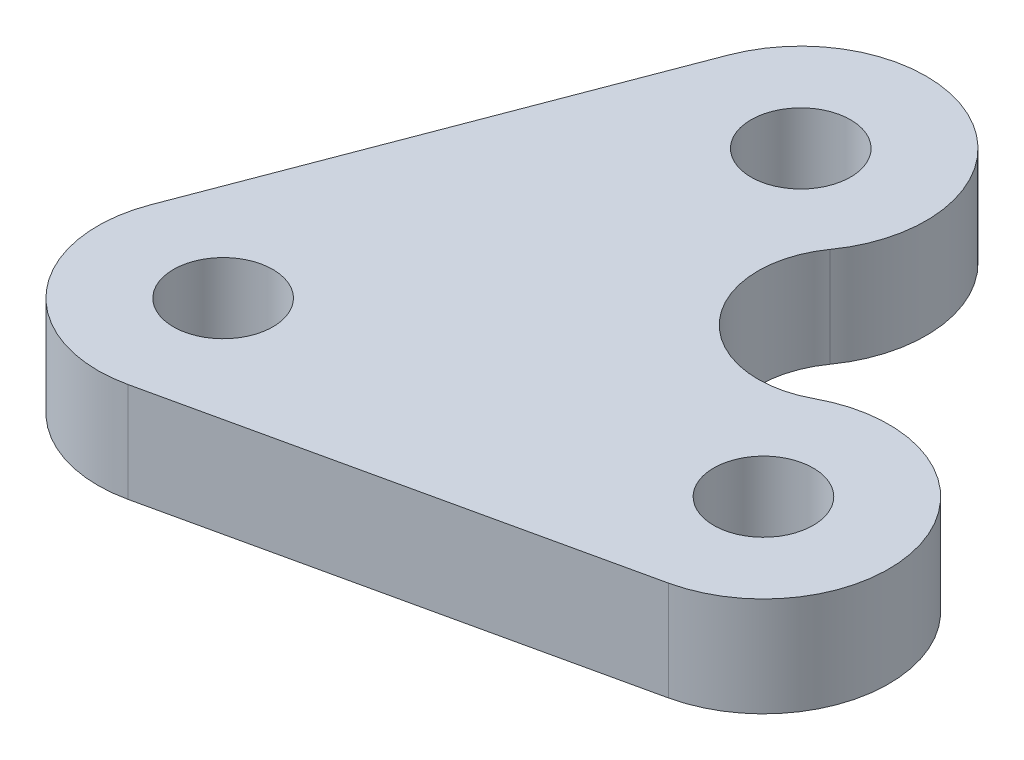
ISO-10303-21;
HEADER;
FILE_DESCRIPTION(('STEP AP214'),'2;1');
FILE_NAME('part.step','',(''),(''),'','','');
FILE_SCHEMA(('AUTOMOTIVE_DESIGN { 1 0 10303 214 1 1 1 1 }'));
ENDSEC;
DATA;
#1=APPLICATION_CONTEXT('core data for automotive mechanical design processes');
#2=APPLICATION_PROTOCOL_DEFINITION('international standard','automotive_design',2000,#1);
#3=PRODUCT_CONTEXT('',#1,'mechanical');
#4=PRODUCT('Part','Part','',(#3));
#5=PRODUCT_RELATED_PRODUCT_CATEGORY('part','',(#4));
#6=PRODUCT_DEFINITION_FORMATION('','',#4);
#7=PRODUCT_DEFINITION_CONTEXT('part definition',#1,'design');
#8=PRODUCT_DEFINITION('design','',#6,#7);
#9=PRODUCT_DEFINITION_SHAPE('','',#8);
#10=(LENGTH_UNIT() NAMED_UNIT(*) SI_UNIT(.MILLI.,.METRE.));
#11=(NAMED_UNIT(*) PLANE_ANGLE_UNIT() SI_UNIT($,.RADIAN.));
#12=(NAMED_UNIT(*) SI_UNIT($,.STERADIAN.) SOLID_ANGLE_UNIT());
#13=UNCERTAINTY_MEASURE_WITH_UNIT(LENGTH_MEASURE(1.E-05),#10,'distance_accuracy_value','');
#14=(GEOMETRIC_REPRESENTATION_CONTEXT(3) GLOBAL_UNCERTAINTY_ASSIGNED_CONTEXT((#13)) GLOBAL_UNIT_ASSIGNED_CONTEXT((#10,
#11,#12)) REPRESENTATION_CONTEXT('',''));
#15=CARTESIAN_POINT('',(0.,0.,0.));
#16=DIRECTION('',(0.,0.,1.));
#17=DIRECTION('',(1.,0.,0.));
#18=AXIS2_PLACEMENT_3D('',#15,#16,#17);
#19=CARTESIAN_POINT('',(19.8336046260215,0.,38.1));
#20=DIRECTION('',(0.,-1.,0.));
#21=DIRECTION('',(1.,0.,0.));
#22=AXIS2_PLACEMENT_3D('',#19,#20,#21);
#23=CYLINDRICAL_SURFACE('',#22,3.175);
#24=CARTESIAN_POINT('',(19.8336046260215,0.,38.1));
#25=DIRECTION('',(0.,-1.,0.));
#26=DIRECTION('',(1.,0.,0.));
#27=AXIS2_PLACEMENT_3D('',#24,#25,#26);
#28=CIRCLE('',#27,3.175);
#29=CARTESIAN_POINT('',(16.6586046260215,0.,38.1));
#30=VERTEX_POINT('',#29);
#31=EDGE_CURVE('E39',#30,#30,#28,.T.);
#32=ORIENTED_EDGE('',*,*,#31,.F.);
#33=DIRECTION('',(0.,-1.,0.));
#34=VECTOR('',#33,1.);
#35=CARTESIAN_POINT('',(16.6586046260215,0.,38.1));
#36=LINE('',#35,#34);
#37=CARTESIAN_POINT('',(16.6586046260215,-6.35,38.1));
#38=VERTEX_POINT('',#37);
#39=EDGE_CURVE('E11',#30,#38,#36,.T.);
#40=ORIENTED_EDGE('',*,*,#39,.T.);
#41=CARTESIAN_POINT('',(19.8336046260215,-6.35,38.1));
#42=DIRECTION('',(0.,1.,0.));
#43=DIRECTION('',(1.,0.,0.));
#44=AXIS2_PLACEMENT_3D('',#41,#42,#43);
#45=CIRCLE('',#44,3.175);
#46=EDGE_CURVE('E186',#38,#38,#45,.T.);
#47=ORIENTED_EDGE('',*,*,#46,.F.);
#48=ORIENTED_EDGE('',*,*,#39,.F.);
#49=EDGE_LOOP('',(#32,#40,#47,#48));
#50=FACE_BOUND('',#49,.T.);
#51=ADVANCED_FACE('F16',(#50),#23,.F.);
#52=CARTESIAN_POINT('',(-8.38170556805383,0.,44.3683830899938));
#53=DIRECTION('',(0.,-1.,0.));
#54=DIRECTION('',(1.,0.,0.));
#55=AXIS2_PLACEMENT_3D('',#52,#53,#54);
#56=CYLINDRICAL_SURFACE('',#55,3.175);
#57=CARTESIAN_POINT('',(-8.38170556805383,0.,44.3683830899938));
#58=DIRECTION('',(0.,-1.,0.));
#59=DIRECTION('',(1.,0.,0.));
#60=AXIS2_PLACEMENT_3D('',#57,#58,#59);
#61=CIRCLE('',#60,3.175);
#62=CARTESIAN_POINT('',(-11.5567055680538,0.,44.3683830899938));
#63=VERTEX_POINT('',#62);
#64=EDGE_CURVE('E153',#63,#63,#61,.T.);
#65=ORIENTED_EDGE('',*,*,#64,.F.);
#66=DIRECTION('',(0.,-1.,0.));
#67=VECTOR('',#66,1.);
#68=CARTESIAN_POINT('',(-11.5567055680538,0.,44.3683830899938));
#69=LINE('',#68,#67);
#70=CARTESIAN_POINT('',(-11.5567055680538,-6.35,44.3683830899938));
#71=VERTEX_POINT('',#70);
#72=EDGE_CURVE('E27',#63,#71,#69,.T.);
#73=ORIENTED_EDGE('',*,*,#72,.T.);
#74=CARTESIAN_POINT('',(-8.38170556805383,-6.35,44.3683830899938));
#75=DIRECTION('',(0.,1.,0.));
#76=DIRECTION('',(1.,0.,0.));
#77=AXIS2_PLACEMENT_3D('',#74,#75,#76);
#78=CIRCLE('',#77,3.175);
#79=EDGE_CURVE('E158',#71,#71,#78,.T.);
#80=ORIENTED_EDGE('',*,*,#79,.F.);
#81=ORIENTED_EDGE('',*,*,#72,.F.);
#82=EDGE_LOOP('',(#65,#73,#80,#81));
#83=FACE_BOUND('',#82,.T.);
#84=ADVANCED_FACE('F244',(#83),#56,.F.);
#85=CARTESIAN_POINT('',(1.77593854121521,0.,17.6597161230815));
#86=DIRECTION('',(0.,-1.,0.));
#87=DIRECTION('',(1.,0.,0.));
#88=AXIS2_PLACEMENT_3D('',#85,#86,#87);
#89=CYLINDRICAL_SURFACE('',#88,3.175);
#90=CARTESIAN_POINT('',(1.77593854121521,0.,17.6597161230815));
#91=DIRECTION('',(0.,-1.,0.));
#92=DIRECTION('',(1.,0.,0.));
#93=AXIS2_PLACEMENT_3D('',#90,#91,#92);
#94=CIRCLE('',#93,3.175);
#95=CARTESIAN_POINT('',(-1.3990614587848,0.,17.6597161230815));
#96=VERTEX_POINT('',#95);
#97=EDGE_CURVE('E149',#96,#96,#94,.T.);
#98=ORIENTED_EDGE('',*,*,#97,.F.);
#99=DIRECTION('',(0.,-1.,0.));
#100=VECTOR('',#99,1.);
#101=CARTESIAN_POINT('',(-1.39906145878479,0.,17.6597161230815));
#102=LINE('',#101,#100);
#103=CARTESIAN_POINT('',(-1.3990614587848,-6.35,17.6597161230815));
#104=VERTEX_POINT('',#103);
#105=EDGE_CURVE('E145',#96,#104,#102,.T.);
#106=ORIENTED_EDGE('',*,*,#105,.T.);
#107=CARTESIAN_POINT('',(1.77593854121521,-6.35,17.6597161230815));
#108=DIRECTION('',(0.,1.,0.));
#109=DIRECTION('',(1.,0.,0.));
#110=AXIS2_PLACEMENT_3D('',#107,#108,#109);
#111=CIRCLE('',#110,3.175);
#112=EDGE_CURVE('E154',#104,#104,#111,.T.);
#113=ORIENTED_EDGE('',*,*,#112,.F.);
#114=ORIENTED_EDGE('',*,*,#105,.F.);
#115=EDGE_LOOP('',(#98,#106,#113,#114));
#116=FACE_BOUND('',#115,.T.);
#117=ADVANCED_FACE('F249',(#116),#89,.F.);
#118=CARTESIAN_POINT('',(-8.38170556805383,0.,44.3683830899938));
#119=DIRECTION('',(0.,-1.,0.));
#120=DIRECTION('',(-0.934686508028427,0.,-0.355473109685705));
#121=AXIS2_PLACEMENT_3D('',#118,#119,#120);
#122=CYLINDRICAL_SURFACE('',#121,8.0000000000001);
#123=CARTESIAN_POINT('',(-8.38170556805383,0.,44.3683830899938));
#124=DIRECTION('',(0.,1.,0.));
#125=DIRECTION('',(-0.934686508028427,0.,-0.355473109685705));
#126=AXIS2_PLACEMENT_3D('',#123,#124,#125);
#127=CIRCLE('',#126,8.0000000000001);
#128=CARTESIAN_POINT('',(-15.8591976322813,0.,41.5245982125082));
#129=VERTEX_POINT('',#128);
#130=CARTESIAN_POINT('',(-6.64670656688789,0.,52.1779783718221));
#131=VERTEX_POINT('',#130);
#132=EDGE_CURVE('E105',#129,#131,#127,.T.);
#133=ORIENTED_EDGE('',*,*,#132,.F.);
#134=DIRECTION('',(0.,-1.,0.));
#135=VECTOR('',#134,1.);
#136=CARTESIAN_POINT('',(-15.8591976322813,0.,41.5245982125082));
#137=LINE('',#136,#135);
#138=CARTESIAN_POINT('',(-15.8591976322813,-6.35,41.5245982125082));
#139=VERTEX_POINT('',#138);
#140=EDGE_CURVE('E125',#129,#139,#137,.T.);
#141=ORIENTED_EDGE('',*,*,#140,.T.);
#142=CARTESIAN_POINT('',(-8.38170556805383,-6.35,44.3683830899938));
#143=DIRECTION('',(0.,-1.,0.));
#144=DIRECTION('',(-0.934686508028427,0.,-0.355473109685705));
#145=AXIS2_PLACEMENT_3D('',#142,#143,#144);
#146=CIRCLE('',#145,8.0000000000001);
#147=CARTESIAN_POINT('',(-6.64670656688789,-6.35,52.1779783718221));
#148=VERTEX_POINT('',#147);
#149=EDGE_CURVE('E20',#148,#139,#146,.T.);
#150=ORIENTED_EDGE('',*,*,#149,.F.);
#151=DIRECTION('',(0.,-1.,0.));
#152=VECTOR('',#151,1.);
#153=CARTESIAN_POINT('',(-6.64670656688789,0.,52.1779783718221));
#154=LINE('',#153,#152);
#155=EDGE_CURVE('E120',#131,#148,#154,.T.);
#156=ORIENTED_EDGE('',*,*,#155,.F.);
#157=EDGE_LOOP('',(#133,#141,#150,#156));
#158=FACE_BOUND('',#157,.T.);
#159=ADVANCED_FACE('F121',(#158),#122,.T.);
#160=CARTESIAN_POINT('',(21.5686036271875,0.,45.9095952818283));
#161=DIRECTION('',(0.21687487514574,0.,0.976199410228525));
#162=DIRECTION('',(0.,-1.,0.));
#163=AXIS2_PLACEMENT_3D('',#160,#161,#162);
#164=PLANE('',#163);
#165=DIRECTION('',(0.976199410228525,0.,-0.21687487514574));
#166=VECTOR('',#165,1.);
#167=CARTESIAN_POINT('',(-6.64670656688789,0.,52.1779783718221));
#168=LINE('',#167,#166);
#169=CARTESIAN_POINT('',(21.5686036271875,0.,45.9095952818283));
#170=VERTEX_POINT('',#169);
#171=EDGE_CURVE('E110',#131,#170,#168,.T.);
#172=ORIENTED_EDGE('',*,*,#171,.F.);
#173=ORIENTED_EDGE('',*,*,#155,.T.);
#174=DIRECTION('',(-0.976199410228525,0.,0.21687487514574));
#175=VECTOR('',#174,1.);
#176=CARTESIAN_POINT('',(-6.64670656688789,-6.35,52.1779783718221));
#177=LINE('',#176,#175);
#178=CARTESIAN_POINT('',(21.5686036271875,-6.35,45.9095952818283));
#179=VERTEX_POINT('',#178);
#180=EDGE_CURVE('E218',#179,#148,#177,.T.);
#181=ORIENTED_EDGE('',*,*,#180,.F.);
#182=DIRECTION('',(0.,-1.,0.));
#183=VECTOR('',#182,1.);
#184=CARTESIAN_POINT('',(21.5686036271875,0.,45.9095952818283));
#185=LINE('',#184,#183);
#186=EDGE_CURVE('E126',#170,#179,#185,.T.);
#187=ORIENTED_EDGE('',*,*,#186,.F.);
#188=EDGE_LOOP('',(#172,#173,#181,#187));
#189=FACE_BOUND('',#188,.T.);
#190=ADVANCED_FACE('F18',(#189),#164,.T.);
#191=CARTESIAN_POINT('',(19.8336046260215,0.,38.1));
#192=DIRECTION('',(0.,-1.,0.));
#193=DIRECTION('',(0.936945615897928,0.,-0.349475196329657));
#194=AXIS2_PLACEMENT_3D('',#191,#192,#193);
#195=CYLINDRICAL_SURFACE('',#194,8.00000000000011);
#196=CARTESIAN_POINT('',(19.8336046260215,0.,38.1));
#197=DIRECTION('',(0.,1.,0.));
#198=DIRECTION('',(0.216874875145739,0.,0.976199410228525));
#199=AXIS2_PLACEMENT_3D('',#196,#197,#198);
#200=CIRCLE('',#199,8.00000000000011);
#201=CARTESIAN_POINT('',(16.0304665719188,0.,31.0618084040403));
#202=VERTEX_POINT('',#201);
#203=EDGE_CURVE('E131',#170,#202,#200,.T.);
#204=ORIENTED_EDGE('',*,*,#203,.F.);
#205=ORIENTED_EDGE('',*,*,#186,.T.);
#206=CARTESIAN_POINT('',(19.8336046260215,-6.35,38.1));
#207=DIRECTION('',(0.,-1.,0.));
#208=DIRECTION('',(0.216874875145739,0.,0.976199410228525));
#209=AXIS2_PLACEMENT_3D('',#206,#207,#208);
#210=CIRCLE('',#209,8.00000000000011);
#211=CARTESIAN_POINT('',(16.0304665719188,-6.35,31.0618084040403));
#212=VERTEX_POINT('',#211);
#213=EDGE_CURVE('E181',#212,#179,#210,.T.);
#214=ORIENTED_EDGE('',*,*,#213,.F.);
#215=DIRECTION('',(0.,-1.,0.));
#216=VECTOR('',#215,1.);
#217=CARTESIAN_POINT('',(16.0304665719188,0.,31.0618084040403));
#218=LINE('',#217,#216);
#219=EDGE_CURVE('E171',#202,#212,#218,.T.);
#220=ORIENTED_EDGE('',*,*,#219,.F.);
#221=EDGE_LOOP('',(#204,#205,#214,#220));
#222=FACE_BOUND('',#221,.T.);
#223=ADVANCED_FACE('F233',(#222),#195,.T.);
#224=CARTESIAN_POINT('',(13.1781130313417,0.,25.7831647070706));
#225=DIRECTION('',(0.,-1.,0.));
#226=DIRECTION('',(-0.814441035009026,0.,-0.58024632742778));
#227=AXIS2_PLACEMENT_3D('',#224,#225,#226);
#228=CYLINDRICAL_SURFACE('',#227,6.00000000000008);
#229=CARTESIAN_POINT('',(13.1781130313417,0.,25.7831647070706));
#230=DIRECTION('',(0.,1.,0.));
#231=DIRECTION('',(-0.814441035009026,0.,-0.58024632742778));
#232=AXIS2_PLACEMENT_3D('',#229,#230,#231);
#233=CIRCLE('',#232,6.00000000000008);
#234=CARTESIAN_POINT('',(8.29146682128749,0.,22.3016867425038));
#235=VERTEX_POINT('',#234);
#236=EDGE_CURVE('E168',#235,#202,#233,.T.);
#237=ORIENTED_EDGE('',*,*,#236,.T.);
#238=ORIENTED_EDGE('',*,*,#219,.T.);
#239=CARTESIAN_POINT('',(13.1781130313417,-6.35,25.7831647070706));
#240=DIRECTION('',(0.,1.,0.));
#241=DIRECTION('',(-0.814441035009026,0.,-0.58024632742778));
#242=AXIS2_PLACEMENT_3D('',#239,#240,#241);
#243=CIRCLE('',#242,6.00000000000008);
#244=CARTESIAN_POINT('',(8.29146682128749,-6.35,22.3016867425038));
#245=VERTEX_POINT('',#244);
#246=EDGE_CURVE('E176',#245,#212,#243,.T.);
#247=ORIENTED_EDGE('',*,*,#246,.F.);
#248=DIRECTION('',(0.,-1.,0.));
#249=VECTOR('',#248,1.);
#250=CARTESIAN_POINT('',(8.29146682128749,0.,22.3016867425038));
#251=LINE('',#250,#249);
#252=EDGE_CURVE('E162',#235,#245,#251,.T.);
#253=ORIENTED_EDGE('',*,*,#252,.F.);
#254=EDGE_LOOP('',(#237,#238,#247,#253));
#255=FACE_BOUND('',#254,.T.);
#256=ADVANCED_FACE('F231',(#255),#228,.F.);
#257=CARTESIAN_POINT('',(1.77593854121521,0.,17.6597161230815));
#258=DIRECTION('',(0.,-1.,0.));
#259=DIRECTION('',(0.471706963795754,0.,-0.881755374413216));
#260=AXIS2_PLACEMENT_3D('',#257,#258,#259);
#261=CYLINDRICAL_SURFACE('',#260,8.0000000000001);
#262=CARTESIAN_POINT('',(1.77593854121521,0.,17.6597161230815));
#263=DIRECTION('',(0.,1.,0.));
#264=DIRECTION('',(0.814441035009025,0.,0.580246327427781));
#265=AXIS2_PLACEMENT_3D('',#262,#263,#264);
#266=CIRCLE('',#265,8.0000000000001);
#267=CARTESIAN_POINT('',(-5.70155352301231,0.,14.8159312455959));
#268=VERTEX_POINT('',#267);
#269=EDGE_CURVE('E137',#235,#268,#266,.T.);
#270=ORIENTED_EDGE('',*,*,#269,.F.);
#271=ORIENTED_EDGE('',*,*,#252,.T.);
#272=CARTESIAN_POINT('',(1.77593854121521,-6.35,17.6597161230815));
#273=DIRECTION('',(0.,-1.,0.));
#274=DIRECTION('',(0.814441035009025,0.,0.580246327427781));
#275=AXIS2_PLACEMENT_3D('',#272,#273,#274);
#276=CIRCLE('',#275,8.0000000000001);
#277=CARTESIAN_POINT('',(-5.70155352301231,-6.35,14.8159312455959));
#278=VERTEX_POINT('',#277);
#279=EDGE_CURVE('E180',#278,#245,#276,.T.);
#280=ORIENTED_EDGE('',*,*,#279,.F.);
#281=DIRECTION('',(0.,-1.,0.));
#282=VECTOR('',#281,1.);
#283=CARTESIAN_POINT('',(-5.70155352301231,0.,14.8159312455959));
#284=LINE('',#283,#282);
#285=EDGE_CURVE('E148',#268,#278,#284,.T.);
#286=ORIENTED_EDGE('',*,*,#285,.F.);
#287=EDGE_LOOP('',(#270,#271,#280,#286));
#288=FACE_BOUND('',#287,.T.);
#289=ADVANCED_FACE('F229',(#288),#261,.T.);
#290=CARTESIAN_POINT('',(-15.8591976322813,0.,41.5245982125082));
#291=DIRECTION('',(-0.934686508028427,0.,-0.355473109685706));
#292=DIRECTION('',(-0.355473109685706,0.,0.934686508028427));
#293=AXIS2_PLACEMENT_3D('',#290,#291,#292);
#294=PLANE('',#293);
#295=DIRECTION('',(-0.355473109685706,0.,0.934686508028427));
#296=VECTOR('',#295,1.);
#297=CARTESIAN_POINT('',(-5.70155352301231,0.,14.8159312455959));
#298=LINE('',#297,#296);
#299=EDGE_CURVE('E113',#268,#129,#298,.T.);
#300=ORIENTED_EDGE('',*,*,#299,.F.);
#301=ORIENTED_EDGE('',*,*,#285,.T.);
#302=DIRECTION('',(0.355473109685706,0.,-0.934686508028427));
#303=VECTOR('',#302,1.);
#304=CARTESIAN_POINT('',(-5.70155352301231,-6.35,14.8159312455959));
#305=LINE('',#304,#303);
#306=EDGE_CURVE('E141',#139,#278,#305,.T.);
#307=ORIENTED_EDGE('',*,*,#306,.F.);
#308=ORIENTED_EDGE('',*,*,#140,.F.);
#309=EDGE_LOOP('',(#300,#301,#307,#308));
#310=FACE_BOUND('',#309,.T.);
#311=ADVANCED_FACE('F227',(#310),#294,.T.);
#312=CARTESIAN_POINT('',(5.72594952898385,0.,31.0140496065377));
#313=DIRECTION('',(0.,1.,0.));
#314=DIRECTION('',(1.,0.,0.));
#315=AXIS2_PLACEMENT_3D('',#312,#313,#314);
#316=PLANE('',#315);
#317=ORIENTED_EDGE('',*,*,#299,.T.);
#318=ORIENTED_EDGE('',*,*,#132,.T.);
#319=ORIENTED_EDGE('',*,*,#171,.T.);
#320=ORIENTED_EDGE('',*,*,#203,.T.);
#321=ORIENTED_EDGE('',*,*,#236,.F.);
#322=ORIENTED_EDGE('',*,*,#269,.T.);
#323=EDGE_LOOP('',(#317,#318,#319,#320,#321,#322));
#324=FACE_BOUND('',#323,.T.);
#325=ORIENTED_EDGE('',*,*,#97,.T.);
#326=EDGE_LOOP('',(#325));
#327=FACE_BOUND('',#326,.T.);
#328=ORIENTED_EDGE('',*,*,#64,.T.);
#329=EDGE_LOOP('',(#328));
#330=FACE_BOUND('',#329,.T.);
#331=ORIENTED_EDGE('',*,*,#31,.T.);
#332=EDGE_LOOP('',(#331));
#333=FACE_BOUND('',#332,.T.);
#334=ADVANCED_FACE('F107',(#324,#327,#330,#333),#316,.T.);
#335=CARTESIAN_POINT('',(5.72594952898385,-6.35,31.0140496065377));
#336=DIRECTION('',(0.,1.,0.));
#337=DIRECTION('',(1.,0.,0.));
#338=AXIS2_PLACEMENT_3D('',#335,#336,#337);
#339=PLANE('',#338);
#340=ORIENTED_EDGE('',*,*,#306,.T.);
#341=ORIENTED_EDGE('',*,*,#279,.T.);
#342=ORIENTED_EDGE('',*,*,#246,.T.);
#343=ORIENTED_EDGE('',*,*,#213,.T.);
#344=ORIENTED_EDGE('',*,*,#180,.T.);
#345=ORIENTED_EDGE('',*,*,#149,.T.);
#346=EDGE_LOOP('',(#340,#341,#342,#343,#344,#345));
#347=FACE_BOUND('',#346,.T.);
#348=ORIENTED_EDGE('',*,*,#112,.T.);
#349=EDGE_LOOP('',(#348));
#350=FACE_BOUND('',#349,.T.);
#351=ORIENTED_EDGE('',*,*,#79,.T.);
#352=EDGE_LOOP('',(#351));
#353=FACE_BOUND('',#352,.T.);
#354=ORIENTED_EDGE('',*,*,#46,.T.);
#355=EDGE_LOOP('',(#354));
#356=FACE_BOUND('',#355,.T.);
#357=ADVANCED_FACE('F224',(#347,#350,#353,#356),#339,.F.);
#358=CLOSED_SHELL('',(#51,#84,#117,#159,#190,#223,#256,#289,#311,#334,#357));
#359=MANIFOLD_SOLID_BREP('B1',#358);
#360=ADVANCED_BREP_SHAPE_REPRESENTATION('',(#18,#359),#14);
#361=SHAPE_DEFINITION_REPRESENTATION(#9,#360);
ENDSEC;
END-ISO-10303-21;
